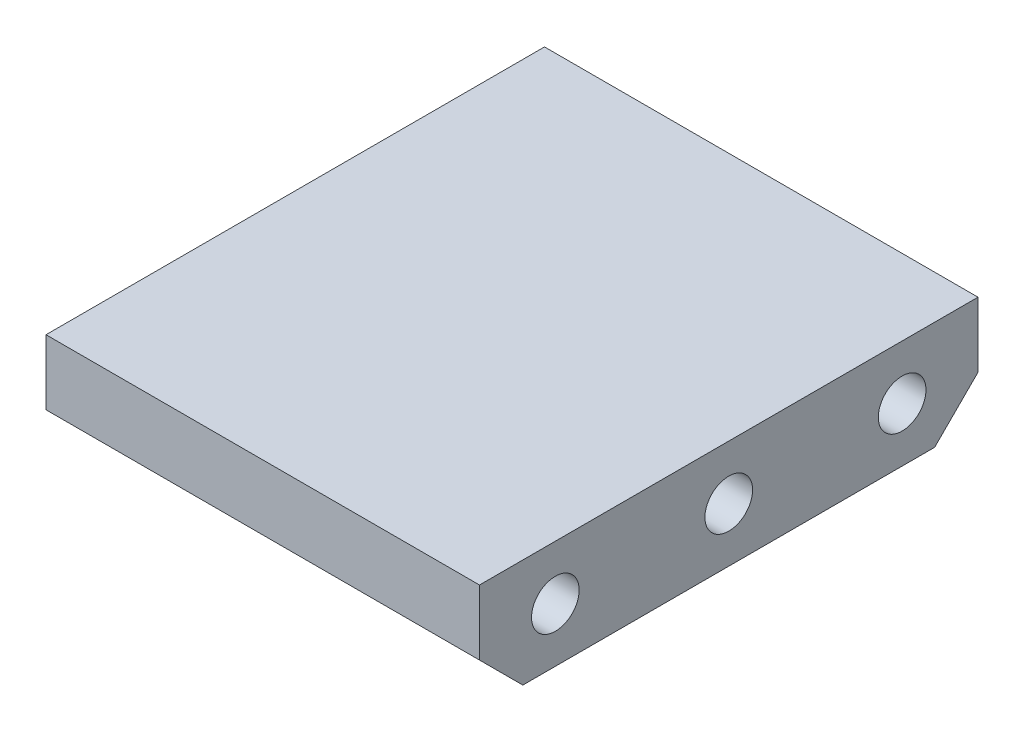
ISO-10303-21;
HEADER;
FILE_DESCRIPTION(('STEP AP214'),'2;1');
FILE_NAME('part.step','',(''),(''),'','','');
FILE_SCHEMA(('AUTOMOTIVE_DESIGN { 1 0 10303 214 1 1 1 1 }'));
ENDSEC;
DATA;
#1=APPLICATION_CONTEXT('core data for automotive mechanical design processes');
#2=APPLICATION_PROTOCOL_DEFINITION('international standard','automotive_design',2000,#1);
#3=PRODUCT_CONTEXT('',#1,'mechanical');
#4=PRODUCT('Part','Part','',(#3));
#5=PRODUCT_RELATED_PRODUCT_CATEGORY('part','',(#4));
#6=PRODUCT_DEFINITION_FORMATION('','',#4);
#7=PRODUCT_DEFINITION_CONTEXT('part definition',#1,'design');
#8=PRODUCT_DEFINITION('design','',#6,#7);
#9=PRODUCT_DEFINITION_SHAPE('','',#8);
#10=(LENGTH_UNIT() NAMED_UNIT(*) SI_UNIT(.MILLI.,.METRE.));
#11=(NAMED_UNIT(*) PLANE_ANGLE_UNIT() SI_UNIT($,.RADIAN.));
#12=(NAMED_UNIT(*) SI_UNIT($,.STERADIAN.) SOLID_ANGLE_UNIT());
#13=UNCERTAINTY_MEASURE_WITH_UNIT(LENGTH_MEASURE(1.E-05),#10,'distance_accuracy_value','');
#14=(GEOMETRIC_REPRESENTATION_CONTEXT(3) GLOBAL_UNCERTAINTY_ASSIGNED_CONTEXT((#13)) GLOBAL_UNIT_ASSIGNED_CONTEXT((#10,
#11,#12)) REPRESENTATION_CONTEXT('',''));
#15=CARTESIAN_POINT('',(0.,0.,0.));
#16=DIRECTION('',(0.,0.,1.));
#17=DIRECTION('',(1.,0.,0.));
#18=AXIS2_PLACEMENT_3D('',#15,#16,#17);
#19=CARTESIAN_POINT('',(100.,0.,0.));
#20=DIRECTION('',(-1.,0.,0.));
#21=DIRECTION('',(0.,0.,1.));
#22=AXIS2_PLACEMENT_3D('',#19,#20,#21);
#23=PLANE('',#22);
#24=DIRECTION('',(0.,1.,0.));
#25=VECTOR('',#24,1.);
#26=CARTESIAN_POINT('',(100.,0.,-115.));
#27=LINE('',#26,#25);
#28=CARTESIAN_POINT('',(100.,-30.,-115.));
#29=VERTEX_POINT('',#28);
#30=CARTESIAN_POINT('',(100.,0.,-115.));
#31=VERTEX_POINT('',#30);
#32=EDGE_CURVE('E128',#29,#31,#27,.T.);
#33=ORIENTED_EDGE('',*,*,#32,.T.);
#34=DIRECTION('',(0.,0.,1.));
#35=VECTOR('',#34,1.);
#36=CARTESIAN_POINT('',(100.,0.,115.));
#37=LINE('',#36,#35);
#38=CARTESIAN_POINT('',(100.,0.,115.));
#39=VERTEX_POINT('',#38);
#40=EDGE_CURVE('E86',#31,#39,#37,.T.);
#41=ORIENTED_EDGE('',*,*,#40,.T.);
#42=DIRECTION('',(0.,-1.,0.));
#43=VECTOR('',#42,1.);
#44=CARTESIAN_POINT('',(100.,0.,115.));
#45=LINE('',#44,#43);
#46=CARTESIAN_POINT('',(100.,-30.,115.));
#47=VERTEX_POINT('',#46);
#48=EDGE_CURVE('E99',#39,#47,#45,.T.);
#49=ORIENTED_EDGE('',*,*,#48,.T.);
#50=DIRECTION('',(0.,-0.707106781186543,-0.707106781186552));
#51=VECTOR('',#50,1.);
#52=CARTESIAN_POINT('',(100.,-30.,115.));
#53=LINE('',#52,#51);
#54=CARTESIAN_POINT('',(100.,-50.,94.9999999999997));
#55=VERTEX_POINT('',#54);
#56=EDGE_CURVE('E93',#47,#55,#53,.T.);
#57=ORIENTED_EDGE('',*,*,#56,.T.);
#58=DIRECTION('',(0.,0.,-1.));
#59=VECTOR('',#58,1.);
#60=CARTESIAN_POINT('',(100.,-50.,-94.9999999999998));
#61=LINE('',#60,#59);
#62=CARTESIAN_POINT('',(100.,-50.,-94.9999999999998));
#63=VERTEX_POINT('',#62);
#64=EDGE_CURVE('E97',#55,#63,#61,.T.);
#65=ORIENTED_EDGE('',*,*,#64,.T.);
#66=DIRECTION('',(0.,0.707106781186544,-0.707106781186551));
#67=VECTOR('',#66,1.);
#68=CARTESIAN_POINT('',(100.,-30.,-115.));
#69=LINE('',#68,#67);
#70=EDGE_CURVE('E49',#63,#29,#69,.T.);
#71=ORIENTED_EDGE('',*,*,#70,.T.);
#72=EDGE_LOOP('',(#33,#41,#49,#57,#65,#71));
#73=FACE_BOUND('',#72,.T.);
#74=CARTESIAN_POINT('',(100.,-25.,0.));
#75=DIRECTION('',(1.,0.,0.));
#76=DIRECTION('',(0.,0.,-1.));
#77=AXIS2_PLACEMENT_3D('',#74,#75,#76);
#78=CIRCLE('',#77,11.);
#79=CARTESIAN_POINT('',(100.,-25.,-11.));
#80=VERTEX_POINT('',#79);
#81=EDGE_CURVE('E121',#80,#80,#78,.T.);
#82=ORIENTED_EDGE('',*,*,#81,.F.);
#83=EDGE_LOOP('',(#82));
#84=FACE_BOUND('',#83,.T.);
#85=CARTESIAN_POINT('',(100.,-25.,80.));
#86=DIRECTION('',(1.,0.,0.));
#87=DIRECTION('',(0.,0.,-1.));
#88=AXIS2_PLACEMENT_3D('',#85,#86,#87);
#89=CIRCLE('',#88,11.);
#90=CARTESIAN_POINT('',(100.,-25.,69.));
#91=VERTEX_POINT('',#90);
#92=EDGE_CURVE('E182',#91,#91,#89,.T.);
#93=ORIENTED_EDGE('',*,*,#92,.F.);
#94=EDGE_LOOP('',(#93));
#95=FACE_BOUND('',#94,.T.);
#96=CARTESIAN_POINT('',(100.,-25.,-80.));
#97=DIRECTION('',(1.,0.,0.));
#98=DIRECTION('',(0.,0.,1.));
#99=AXIS2_PLACEMENT_3D('',#96,#97,#98);
#100=CIRCLE('',#99,11.);
#101=CARTESIAN_POINT('',(100.,-25.,-69.));
#102=VERTEX_POINT('',#101);
#103=EDGE_CURVE('E173',#102,#102,#100,.T.);
#104=ORIENTED_EDGE('',*,*,#103,.F.);
#105=EDGE_LOOP('',(#104));
#106=FACE_BOUND('',#105,.T.);
#107=ADVANCED_FACE('F32',(#73,#84,#95,#106),#23,.F.);
#108=CARTESIAN_POINT('',(-100.,0.,0.));
#109=DIRECTION('',(-1.,0.,0.));
#110=DIRECTION('',(0.,0.,1.));
#111=AXIS2_PLACEMENT_3D('',#108,#109,#110);
#112=PLANE('',#111);
#113=CARTESIAN_POINT('',(-100.,-25.,80.));
#114=DIRECTION('',(1.,0.,0.));
#115=DIRECTION('',(0.,0.,-1.));
#116=AXIS2_PLACEMENT_3D('',#113,#114,#115);
#117=CIRCLE('',#116,11.);
#118=CARTESIAN_POINT('',(-100.,-25.,69.));
#119=VERTEX_POINT('',#118);
#120=EDGE_CURVE('E179',#119,#119,#117,.T.);
#121=ORIENTED_EDGE('',*,*,#120,.T.);
#122=EDGE_LOOP('',(#121));
#123=FACE_BOUND('',#122,.T.);
#124=DIRECTION('',(0.,1.,0.));
#125=VECTOR('',#124,1.);
#126=CARTESIAN_POINT('',(-100.,0.,-115.));
#127=LINE('',#126,#125);
#128=CARTESIAN_POINT('',(-100.,-30.,-115.));
#129=VERTEX_POINT('',#128);
#130=CARTESIAN_POINT('',(-100.,0.,-115.));
#131=VERTEX_POINT('',#130);
#132=EDGE_CURVE('E117',#129,#131,#127,.T.);
#133=ORIENTED_EDGE('',*,*,#132,.F.);
#134=DIRECTION('',(0.,0.707106781186544,-0.707106781186551));
#135=VECTOR('',#134,1.);
#136=CARTESIAN_POINT('',(-100.,-30.,-115.));
#137=LINE('',#136,#135);
#138=CARTESIAN_POINT('',(-100.,-50.,-94.9999999999998));
#139=VERTEX_POINT('',#138);
#140=EDGE_CURVE('E78',#139,#129,#137,.T.);
#141=ORIENTED_EDGE('',*,*,#140,.F.);
#142=DIRECTION('',(0.,0.,-1.));
#143=VECTOR('',#142,1.);
#144=CARTESIAN_POINT('',(-100.,-50.,-94.9999999999998));
#145=LINE('',#144,#143);
#146=CARTESIAN_POINT('',(-100.,-50.,94.9999999999997));
#147=VERTEX_POINT('',#146);
#148=EDGE_CURVE('E72',#147,#139,#145,.T.);
#149=ORIENTED_EDGE('',*,*,#148,.F.);
#150=DIRECTION('',(0.,-0.707106781186543,-0.707106781186552));
#151=VECTOR('',#150,1.);
#152=CARTESIAN_POINT('',(-100.,-30.,115.));
#153=LINE('',#152,#151);
#154=CARTESIAN_POINT('',(-100.,-30.,115.));
#155=VERTEX_POINT('',#154);
#156=EDGE_CURVE('E107',#155,#147,#153,.T.);
#157=ORIENTED_EDGE('',*,*,#156,.F.);
#158=DIRECTION('',(0.,-1.,0.));
#159=VECTOR('',#158,1.);
#160=CARTESIAN_POINT('',(-100.,0.,115.));
#161=LINE('',#160,#159);
#162=CARTESIAN_POINT('',(-100.,0.,115.));
#163=VERTEX_POINT('',#162);
#164=EDGE_CURVE('E123',#163,#155,#161,.T.);
#165=ORIENTED_EDGE('',*,*,#164,.F.);
#166=DIRECTION('',(0.,0.,1.));
#167=VECTOR('',#166,1.);
#168=CARTESIAN_POINT('',(-100.,0.,115.));
#169=LINE('',#168,#167);
#170=EDGE_CURVE('E120',#131,#163,#169,.T.);
#171=ORIENTED_EDGE('',*,*,#170,.F.);
#172=EDGE_LOOP('',(#133,#141,#149,#157,#165,#171));
#173=FACE_BOUND('',#172,.T.);
#174=CARTESIAN_POINT('',(-100.,-25.,0.));
#175=DIRECTION('',(1.,0.,0.));
#176=DIRECTION('',(0.,0.,-1.));
#177=AXIS2_PLACEMENT_3D('',#174,#175,#176);
#178=CIRCLE('',#177,11.);
#179=CARTESIAN_POINT('',(-100.,-25.,-11.));
#180=VERTEX_POINT('',#179);
#181=EDGE_CURVE('E185',#180,#180,#178,.T.);
#182=ORIENTED_EDGE('',*,*,#181,.T.);
#183=EDGE_LOOP('',(#182));
#184=FACE_BOUND('',#183,.T.);
#185=CARTESIAN_POINT('',(-100.,-25.,-80.));
#186=DIRECTION('',(1.,0.,0.));
#187=DIRECTION('',(0.,0.,1.));
#188=AXIS2_PLACEMENT_3D('',#185,#186,#187);
#189=CIRCLE('',#188,11.);
#190=CARTESIAN_POINT('',(-100.,-25.,-69.));
#191=VERTEX_POINT('',#190);
#192=EDGE_CURVE('E176',#191,#191,#189,.T.);
#193=ORIENTED_EDGE('',*,*,#192,.T.);
#194=EDGE_LOOP('',(#193));
#195=FACE_BOUND('',#194,.T.);
#196=ADVANCED_FACE('F137',(#123,#173,#184,#195),#112,.T.);
#197=CARTESIAN_POINT('',(100.,0.,-115.));
#198=DIRECTION('',(0.,0.,1.));
#199=DIRECTION('',(0.,-1.,0.));
#200=AXIS2_PLACEMENT_3D('',#197,#198,#199);
#201=PLANE('',#200);
#202=ORIENTED_EDGE('',*,*,#132,.T.);
#203=DIRECTION('',(-1.,0.,0.));
#204=VECTOR('',#203,1.);
#205=CARTESIAN_POINT('',(100.,0.,-115.));
#206=LINE('',#205,#204);
#207=EDGE_CURVE('E11',#31,#131,#206,.T.);
#208=ORIENTED_EDGE('',*,*,#207,.F.);
#209=ORIENTED_EDGE('',*,*,#32,.F.);
#210=DIRECTION('',(-1.,0.,0.));
#211=VECTOR('',#210,1.);
#212=CARTESIAN_POINT('',(100.,-30.,-115.));
#213=LINE('',#212,#211);
#214=EDGE_CURVE('E113',#29,#129,#213,.T.);
#215=ORIENTED_EDGE('',*,*,#214,.T.);
#216=EDGE_LOOP('',(#202,#208,#209,#215));
#217=FACE_BOUND('',#216,.T.);
#218=ADVANCED_FACE('F34',(#217),#201,.F.);
#219=CARTESIAN_POINT('',(100.,0.,115.));
#220=DIRECTION('',(0.,-1.,0.));
#221=DIRECTION('',(0.,0.,-1.));
#222=AXIS2_PLACEMENT_3D('',#219,#220,#221);
#223=PLANE('',#222);
#224=ORIENTED_EDGE('',*,*,#170,.T.);
#225=DIRECTION('',(-1.,0.,0.));
#226=VECTOR('',#225,1.);
#227=CARTESIAN_POINT('',(100.,0.,115.));
#228=LINE('',#227,#226);
#229=EDGE_CURVE('E41',#39,#163,#228,.T.);
#230=ORIENTED_EDGE('',*,*,#229,.F.);
#231=ORIENTED_EDGE('',*,*,#40,.F.);
#232=ORIENTED_EDGE('',*,*,#207,.T.);
#233=EDGE_LOOP('',(#224,#230,#231,#232));
#234=FACE_BOUND('',#233,.T.);
#235=ADVANCED_FACE('F236',(#234),#223,.F.);
#236=CARTESIAN_POINT('',(100.,0.,115.));
#237=DIRECTION('',(0.,0.,-1.));
#238=DIRECTION('',(0.,1.,0.));
#239=AXIS2_PLACEMENT_3D('',#236,#237,#238);
#240=PLANE('',#239);
#241=ORIENTED_EDGE('',*,*,#164,.T.);
#242=DIRECTION('',(-1.,0.,0.));
#243=VECTOR('',#242,1.);
#244=CARTESIAN_POINT('',(100.,-30.,115.));
#245=LINE('',#244,#243);
#246=EDGE_CURVE('E108',#47,#155,#245,.T.);
#247=ORIENTED_EDGE('',*,*,#246,.F.);
#248=ORIENTED_EDGE('',*,*,#48,.F.);
#249=ORIENTED_EDGE('',*,*,#229,.T.);
#250=EDGE_LOOP('',(#241,#247,#248,#249));
#251=FACE_BOUND('',#250,.T.);
#252=ADVANCED_FACE('F134',(#251),#240,.F.);
#253=CARTESIAN_POINT('',(100.,-30.,115.));
#254=DIRECTION('',(0.,0.707106781186552,-0.707106781186543));
#255=DIRECTION('',(0.,0.707106781186543,0.707106781186552));
#256=AXIS2_PLACEMENT_3D('',#253,#254,#255);
#257=PLANE('',#256);
#258=ORIENTED_EDGE('',*,*,#156,.T.);
#259=DIRECTION('',(-1.,0.,0.));
#260=VECTOR('',#259,1.);
#261=CARTESIAN_POINT('',(100.,-50.,94.9999999999997));
#262=LINE('',#261,#260);
#263=EDGE_CURVE('E104',#55,#147,#262,.T.);
#264=ORIENTED_EDGE('',*,*,#263,.F.);
#265=ORIENTED_EDGE('',*,*,#56,.F.);
#266=ORIENTED_EDGE('',*,*,#246,.T.);
#267=EDGE_LOOP('',(#258,#264,#265,#266));
#268=FACE_BOUND('',#267,.T.);
#269=ADVANCED_FACE('F105',(#268),#257,.F.);
#270=CARTESIAN_POINT('',(100.,-50.,-94.9999999999998));
#271=DIRECTION('',(0.,1.,0.));
#272=DIRECTION('',(0.,0.,1.));
#273=AXIS2_PLACEMENT_3D('',#270,#271,#272);
#274=PLANE('',#273);
#275=ORIENTED_EDGE('',*,*,#148,.T.);
#276=DIRECTION('',(-1.,0.,0.));
#277=VECTOR('',#276,1.);
#278=CARTESIAN_POINT('',(100.,-50.,-94.9999999999998));
#279=LINE('',#278,#277);
#280=EDGE_CURVE('E109',#63,#139,#279,.T.);
#281=ORIENTED_EDGE('',*,*,#280,.F.);
#282=ORIENTED_EDGE('',*,*,#64,.F.);
#283=ORIENTED_EDGE('',*,*,#263,.T.);
#284=EDGE_LOOP('',(#275,#281,#282,#283));
#285=FACE_BOUND('',#284,.T.);
#286=ADVANCED_FACE('F111',(#285),#274,.F.);
#287=CARTESIAN_POINT('',(100.,-30.,-115.));
#288=DIRECTION('',(0.,0.707106781186552,0.707106781186544));
#289=DIRECTION('',(0.,-0.707106781186544,0.707106781186551));
#290=AXIS2_PLACEMENT_3D('',#287,#288,#289);
#291=PLANE('',#290);
#292=ORIENTED_EDGE('',*,*,#140,.T.);
#293=ORIENTED_EDGE('',*,*,#214,.F.);
#294=ORIENTED_EDGE('',*,*,#70,.F.);
#295=ORIENTED_EDGE('',*,*,#280,.T.);
#296=EDGE_LOOP('',(#292,#293,#294,#295));
#297=FACE_BOUND('',#296,.T.);
#298=ADVANCED_FACE('F142',(#297),#291,.F.);
#299=CARTESIAN_POINT('',(100.,-25.,0.));
#300=DIRECTION('',(-1.,0.,0.));
#301=DIRECTION('',(0.,0.,1.));
#302=AXIS2_PLACEMENT_3D('',#299,#300,#301);
#303=CYLINDRICAL_SURFACE('',#302,11.);
#304=ORIENTED_EDGE('',*,*,#81,.T.);
#305=EDGE_LOOP('',(#304));
#306=FACE_BOUND('',#305,.T.);
#307=ORIENTED_EDGE('',*,*,#181,.F.);
#308=EDGE_LOOP('',(#307));
#309=FACE_BOUND('',#308,.T.);
#310=ADVANCED_FACE('F144',(#306,#309),#303,.F.);
#311=CARTESIAN_POINT('',(100.,-25.,80.));
#312=DIRECTION('',(-1.,0.,0.));
#313=DIRECTION('',(0.,0.,1.));
#314=AXIS2_PLACEMENT_3D('',#311,#312,#313);
#315=CYLINDRICAL_SURFACE('',#314,11.);
#316=ORIENTED_EDGE('',*,*,#92,.T.);
#317=EDGE_LOOP('',(#316));
#318=FACE_BOUND('',#317,.T.);
#319=ORIENTED_EDGE('',*,*,#120,.F.);
#320=EDGE_LOOP('',(#319));
#321=FACE_BOUND('',#320,.T.);
#322=ADVANCED_FACE('F150',(#318,#321),#315,.F.);
#323=CARTESIAN_POINT('',(100.,-25.,-80.));
#324=DIRECTION('',(-1.,0.,0.));
#325=DIRECTION('',(0.,0.,1.));
#326=AXIS2_PLACEMENT_3D('',#323,#324,#325);
#327=CYLINDRICAL_SURFACE('',#326,11.);
#328=ORIENTED_EDGE('',*,*,#103,.T.);
#329=EDGE_LOOP('',(#328));
#330=FACE_BOUND('',#329,.T.);
#331=ORIENTED_EDGE('',*,*,#192,.F.);
#332=EDGE_LOOP('',(#331));
#333=FACE_BOUND('',#332,.T.);
#334=ADVANCED_FACE('F164',(#330,#333),#327,.F.);
#335=CLOSED_SHELL('',(#107,#196,#218,#235,#252,#269,#286,#298,#310,#322,#334));
#336=MANIFOLD_SOLID_BREP('B2',#335);
#337=ADVANCED_BREP_SHAPE_REPRESENTATION('',(#18,#336),#14);
#338=SHAPE_DEFINITION_REPRESENTATION(#9,#337);
ENDSEC;
END-ISO-10303-21;
